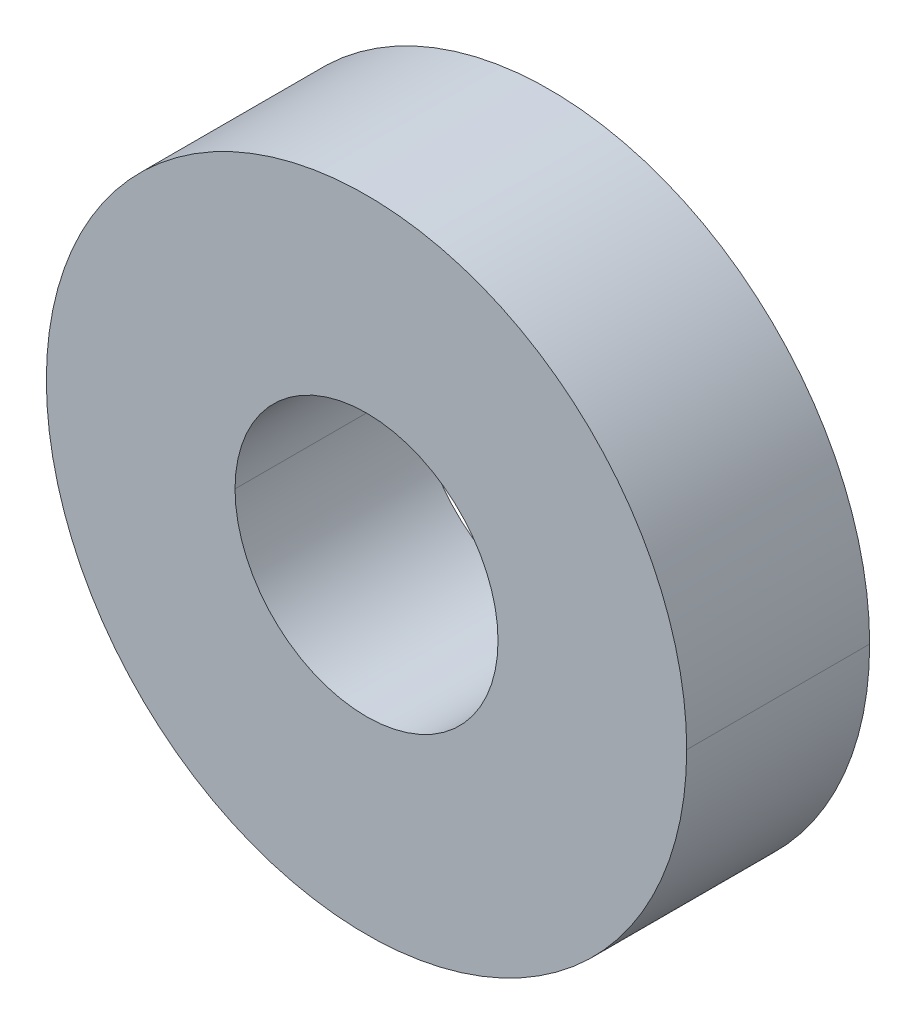
ISO-10303-21;
HEADER;
FILE_DESCRIPTION(('STEP AP214'),'2;1');
FILE_NAME('part.step','',(''),(''),'','','');
FILE_SCHEMA(('AUTOMOTIVE_DESIGN { 1 0 10303 214 1 1 1 1 }'));
ENDSEC;
DATA;
#1=APPLICATION_CONTEXT('core data for automotive mechanical design processes');
#2=APPLICATION_PROTOCOL_DEFINITION('international standard','automotive_design',2000,#1);
#3=PRODUCT_CONTEXT('',#1,'mechanical');
#4=PRODUCT('Part','Part','',(#3));
#5=PRODUCT_RELATED_PRODUCT_CATEGORY('part','',(#4));
#6=PRODUCT_DEFINITION_FORMATION('','',#4);
#7=PRODUCT_DEFINITION_CONTEXT('part definition',#1,'design');
#8=PRODUCT_DEFINITION('design','',#6,#7);
#9=PRODUCT_DEFINITION_SHAPE('','',#8);
#10=(LENGTH_UNIT() NAMED_UNIT(*) SI_UNIT(.MILLI.,.METRE.));
#11=(NAMED_UNIT(*) PLANE_ANGLE_UNIT() SI_UNIT($,.RADIAN.));
#12=(NAMED_UNIT(*) SI_UNIT($,.STERADIAN.) SOLID_ANGLE_UNIT());
#13=UNCERTAINTY_MEASURE_WITH_UNIT(LENGTH_MEASURE(1.E-05),#10,'distance_accuracy_value','');
#14=(GEOMETRIC_REPRESENTATION_CONTEXT(3) GLOBAL_UNCERTAINTY_ASSIGNED_CONTEXT((#13)) GLOBAL_UNIT_ASSIGNED_CONTEXT((#10,
#11,#12)) REPRESENTATION_CONTEXT('',''));
#15=CARTESIAN_POINT('',(0.,0.,0.));
#16=DIRECTION('',(0.,0.,1.));
#17=DIRECTION('',(1.,0.,0.));
#18=AXIS2_PLACEMENT_3D('',#15,#16,#17);
#19=CARTESIAN_POINT('',(0.,0.,8.));
#20=DIRECTION('',(0.,0.,-1.));
#21=DIRECTION('',(-1.,0.,0.));
#22=AXIS2_PLACEMENT_3D('',#19,#20,#21);
#23=CYLINDRICAL_SURFACE('',#22,5.75);
#24=CARTESIAN_POINT('',(0.,0.,8.));
#25=DIRECTION('',(0.,0.,1.));
#26=DIRECTION('',(1.,0.,0.));
#27=AXIS2_PLACEMENT_3D('',#24,#25,#26);
#28=CIRCLE('',#27,5.75);
#29=CARTESIAN_POINT('',(-5.75,0.,8.));
#30=VERTEX_POINT('',#29);
#31=CARTESIAN_POINT('',(5.75,0.,8.));
#32=VERTEX_POINT('',#31);
#33=EDGE_CURVE('E11',#30,#32,#28,.T.);
#34=ORIENTED_EDGE('',*,*,#33,.T.);
#35=DIRECTION('',(0.,0.,-1.));
#36=VECTOR('',#35,1.);
#37=CARTESIAN_POINT('',(5.75,0.,8.));
#38=LINE('',#37,#36);
#39=CARTESIAN_POINT('',(5.75,0.,0.));
#40=VERTEX_POINT('',#39);
#41=EDGE_CURVE('E28',#32,#40,#38,.T.);
#42=ORIENTED_EDGE('',*,*,#41,.T.);
#43=CARTESIAN_POINT('',(0.,0.,0.));
#44=DIRECTION('',(0.,0.,1.));
#45=DIRECTION('',(1.,0.,0.));
#46=AXIS2_PLACEMENT_3D('',#43,#44,#45);
#47=CIRCLE('',#46,5.75);
#48=CARTESIAN_POINT('',(-5.75,0.,0.));
#49=VERTEX_POINT('',#48);
#50=EDGE_CURVE('E81',#49,#40,#47,.T.);
#51=ORIENTED_EDGE('',*,*,#50,.F.);
#52=DIRECTION('',(0.,0.,-1.));
#53=VECTOR('',#52,1.);
#54=CARTESIAN_POINT('',(-5.75,0.,8.));
#55=LINE('',#54,#53);
#56=EDGE_CURVE('E70',#30,#49,#55,.T.);
#57=ORIENTED_EDGE('',*,*,#56,.F.);
#58=EDGE_LOOP('',(#34,#42,#51,#57));
#59=FACE_BOUND('',#58,.T.);
#60=ADVANCED_FACE('F17',(#59),#23,.F.);
#61=CARTESIAN_POINT('',(0.,0.,8.));
#62=DIRECTION('',(0.,0.,-1.));
#63=DIRECTION('',(-1.,0.,0.));
#64=AXIS2_PLACEMENT_3D('',#61,#62,#63);
#65=CYLINDRICAL_SURFACE('',#64,14.);
#66=CARTESIAN_POINT('',(0.,0.,8.));
#67=DIRECTION('',(0.,0.,1.));
#68=DIRECTION('',(1.,0.,0.));
#69=AXIS2_PLACEMENT_3D('',#66,#67,#68);
#70=CIRCLE('',#69,14.);
#71=CARTESIAN_POINT('',(14.,0.,8.));
#72=VERTEX_POINT('',#71);
#73=CARTESIAN_POINT('',(-14.,0.,8.));
#74=VERTEX_POINT('',#73);
#75=EDGE_CURVE('E21',#72,#74,#70,.T.);
#76=ORIENTED_EDGE('',*,*,#75,.F.);
#77=DIRECTION('',(0.,0.,-1.));
#78=VECTOR('',#77,1.);
#79=CARTESIAN_POINT('',(14.,0.,8.));
#80=LINE('',#79,#78);
#81=CARTESIAN_POINT('',(14.,0.,0.));
#82=VERTEX_POINT('',#81);
#83=EDGE_CURVE('E97',#72,#82,#80,.T.);
#84=ORIENTED_EDGE('',*,*,#83,.T.);
#85=CARTESIAN_POINT('',(0.,0.,0.));
#86=DIRECTION('',(0.,0.,1.));
#87=DIRECTION('',(1.,0.,0.));
#88=AXIS2_PLACEMENT_3D('',#85,#86,#87);
#89=CIRCLE('',#88,14.);
#90=CARTESIAN_POINT('',(-14.,0.,0.));
#91=VERTEX_POINT('',#90);
#92=EDGE_CURVE('E101',#82,#91,#89,.T.);
#93=ORIENTED_EDGE('',*,*,#92,.T.);
#94=DIRECTION('',(0.,0.,-1.));
#95=VECTOR('',#94,1.);
#96=CARTESIAN_POINT('',(-14.,0.,8.));
#97=LINE('',#96,#95);
#98=EDGE_CURVE('E87',#74,#91,#97,.T.);
#99=ORIENTED_EDGE('',*,*,#98,.F.);
#100=EDGE_LOOP('',(#76,#84,#93,#99));
#101=FACE_BOUND('',#100,.T.);
#102=ADVANCED_FACE('F128',(#101),#65,.T.);
#103=CARTESIAN_POINT('',(0.,0.,8.));
#104=DIRECTION('',(0.,0.,1.));
#105=DIRECTION('',(1.,0.,0.));
#106=AXIS2_PLACEMENT_3D('',#103,#104,#105);
#107=PLANE('',#106);
#108=CARTESIAN_POINT('',(0.,0.,8.));
#109=DIRECTION('',(0.,0.,1.));
#110=DIRECTION('',(1.,0.,0.));
#111=AXIS2_PLACEMENT_3D('',#108,#109,#110);
#112=CIRCLE('',#111,14.);
#113=EDGE_CURVE('E107',#74,#72,#112,.T.);
#114=ORIENTED_EDGE('',*,*,#113,.T.);
#115=ORIENTED_EDGE('',*,*,#75,.T.);
#116=EDGE_LOOP('',(#114,#115));
#117=FACE_BOUND('',#116,.T.);
#118=ORIENTED_EDGE('',*,*,#33,.F.);
#119=CARTESIAN_POINT('',(0.,0.,8.));
#120=DIRECTION('',(0.,0.,1.));
#121=DIRECTION('',(1.,0.,0.));
#122=AXIS2_PLACEMENT_3D('',#119,#120,#121);
#123=CIRCLE('',#122,5.75);
#124=EDGE_CURVE('E78',#32,#30,#123,.T.);
#125=ORIENTED_EDGE('',*,*,#124,.F.);
#126=EDGE_LOOP('',(#118,#125));
#127=FACE_BOUND('',#126,.T.);
#128=ADVANCED_FACE('F121',(#117,#127),#107,.T.);
#129=CARTESIAN_POINT('',(0.,0.,0.));
#130=DIRECTION('',(0.,0.,1.));
#131=DIRECTION('',(1.,0.,0.));
#132=AXIS2_PLACEMENT_3D('',#129,#130,#131);
#133=PLANE('',#132);
#134=CARTESIAN_POINT('',(0.,0.,0.));
#135=DIRECTION('',(0.,0.,1.));
#136=DIRECTION('',(1.,0.,0.));
#137=AXIS2_PLACEMENT_3D('',#134,#135,#136);
#138=CIRCLE('',#137,14.);
#139=EDGE_CURVE('E92',#91,#82,#138,.T.);
#140=ORIENTED_EDGE('',*,*,#139,.F.);
#141=ORIENTED_EDGE('',*,*,#92,.F.);
#142=EDGE_LOOP('',(#140,#141));
#143=FACE_BOUND('',#142,.T.);
#144=ORIENTED_EDGE('',*,*,#50,.T.);
#145=CARTESIAN_POINT('',(0.,0.,0.));
#146=DIRECTION('',(0.,0.,1.));
#147=DIRECTION('',(1.,0.,0.));
#148=AXIS2_PLACEMENT_3D('',#145,#146,#147);
#149=CIRCLE('',#148,5.75);
#150=EDGE_CURVE('E76',#40,#49,#149,.T.);
#151=ORIENTED_EDGE('',*,*,#150,.T.);
#152=EDGE_LOOP('',(#144,#151));
#153=FACE_BOUND('',#152,.T.);
#154=ADVANCED_FACE('F85',(#143,#153),#133,.F.);
#155=CARTESIAN_POINT('',(0.,0.,8.));
#156=DIRECTION('',(0.,0.,-1.));
#157=DIRECTION('',(-1.,0.,0.));
#158=AXIS2_PLACEMENT_3D('',#155,#156,#157);
#159=CYLINDRICAL_SURFACE('',#158,14.);
#160=ORIENTED_EDGE('',*,*,#83,.F.);
#161=ORIENTED_EDGE('',*,*,#113,.F.);
#162=ORIENTED_EDGE('',*,*,#98,.T.);
#163=ORIENTED_EDGE('',*,*,#139,.T.);
#164=EDGE_LOOP('',(#160,#161,#162,#163));
#165=FACE_BOUND('',#164,.T.);
#166=ADVANCED_FACE('F126',(#165),#159,.T.);
#167=CARTESIAN_POINT('',(0.,0.,8.));
#168=DIRECTION('',(0.,0.,-1.));
#169=DIRECTION('',(-1.,0.,0.));
#170=AXIS2_PLACEMENT_3D('',#167,#168,#169);
#171=CYLINDRICAL_SURFACE('',#170,5.75);
#172=ORIENTED_EDGE('',*,*,#41,.F.);
#173=ORIENTED_EDGE('',*,*,#124,.T.);
#174=ORIENTED_EDGE('',*,*,#56,.T.);
#175=ORIENTED_EDGE('',*,*,#150,.F.);
#176=EDGE_LOOP('',(#172,#173,#174,#175));
#177=FACE_BOUND('',#176,.T.);
#178=ADVANCED_FACE('F19',(#177),#171,.F.);
#179=CLOSED_SHELL('',(#60,#102,#128,#154,#166,#178));
#180=MANIFOLD_SOLID_BREP('B1',#179);
#181=ADVANCED_BREP_SHAPE_REPRESENTATION('',(#18,#180),#14);
#182=SHAPE_DEFINITION_REPRESENTATION(#9,#181);
ENDSEC;
END-ISO-10303-21;
